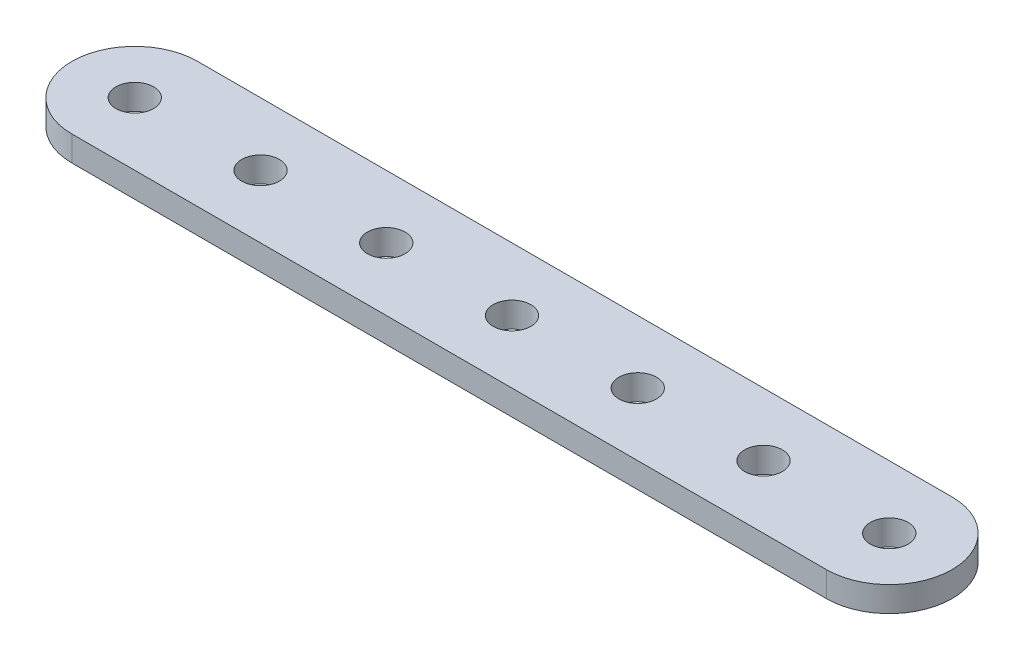
ISO-10303-21;
HEADER;
FILE_DESCRIPTION(('STEP AP214'),'2;1');
FILE_NAME('part.step','',(''),(''),'','','');
FILE_SCHEMA(('AUTOMOTIVE_DESIGN { 1 0 10303 214 1 1 1 1 }'));
ENDSEC;
DATA;
#1=APPLICATION_CONTEXT('core data for automotive mechanical design processes');
#2=APPLICATION_PROTOCOL_DEFINITION('international standard','automotive_design',2000,#1);
#3=PRODUCT_CONTEXT('',#1,'mechanical');
#4=PRODUCT('Part','Part','',(#3));
#5=PRODUCT_RELATED_PRODUCT_CATEGORY('part','',(#4));
#6=PRODUCT_DEFINITION_FORMATION('','',#4);
#7=PRODUCT_DEFINITION_CONTEXT('part definition',#1,'design');
#8=PRODUCT_DEFINITION('design','',#6,#7);
#9=PRODUCT_DEFINITION_SHAPE('','',#8);
#10=(LENGTH_UNIT() NAMED_UNIT(*) SI_UNIT(.MILLI.,.METRE.));
#11=(NAMED_UNIT(*) PLANE_ANGLE_UNIT() SI_UNIT($,.RADIAN.));
#12=(NAMED_UNIT(*) SI_UNIT($,.STERADIAN.) SOLID_ANGLE_UNIT());
#13=UNCERTAINTY_MEASURE_WITH_UNIT(LENGTH_MEASURE(1.E-05),#10,'distance_accuracy_value','');
#14=(GEOMETRIC_REPRESENTATION_CONTEXT(3) GLOBAL_UNCERTAINTY_ASSIGNED_CONTEXT((#13)) GLOBAL_UNIT_ASSIGNED_CONTEXT((#10,
#11,#12)) REPRESENTATION_CONTEXT('',''));
#15=CARTESIAN_POINT('',(0.,0.,0.));
#16=DIRECTION('',(0.,0.,1.));
#17=DIRECTION('',(1.,0.,0.));
#18=AXIS2_PLACEMENT_3D('',#15,#16,#17);
#19=CARTESIAN_POINT('',(-150.,10.,0.));
#20=DIRECTION('',(0.,1.,0.));
#21=DIRECTION('',(0.,0.,1.));
#22=AXIS2_PLACEMENT_3D('',#19,#20,#21);
#23=PLANE('',#22);
#24=CARTESIAN_POINT('',(50.,10.,0.));
#25=DIRECTION('',(0.,1.,0.));
#26=DIRECTION('',(0.,0.,1.));
#27=AXIS2_PLACEMENT_3D('',#24,#25,#26);
#28=CIRCLE('',#27,7.50000000000001);
#29=CARTESIAN_POINT('',(50.,10.,7.50000000000001));
#30=VERTEX_POINT('',#29);
#31=EDGE_CURVE('E171',#30,#30,#28,.T.);
#32=ORIENTED_EDGE('',*,*,#31,.F.);
#33=EDGE_LOOP('',(#32));
#34=FACE_BOUND('',#33,.T.);
#35=CARTESIAN_POINT('',(-50.,10.,0.));
#36=DIRECTION('',(0.,1.,0.));
#37=DIRECTION('',(0.,0.,1.));
#38=AXIS2_PLACEMENT_3D('',#35,#36,#37);
#39=CIRCLE('',#38,7.50000000000001);
#40=CARTESIAN_POINT('',(-50.,10.,7.50000000000001));
#41=VERTEX_POINT('',#40);
#42=EDGE_CURVE('E155',#41,#41,#39,.T.);
#43=ORIENTED_EDGE('',*,*,#42,.F.);
#44=EDGE_LOOP('',(#43));
#45=FACE_BOUND('',#44,.T.);
#46=CARTESIAN_POINT('',(150.,10.,0.));
#47=DIRECTION('',(0.,1.,0.));
#48=DIRECTION('',(0.,0.,1.));
#49=AXIS2_PLACEMENT_3D('',#46,#47,#48);
#50=CIRCLE('',#49,7.50000000000001);
#51=CARTESIAN_POINT('',(150.,10.,7.50000000000001));
#52=VERTEX_POINT('',#51);
#53=EDGE_CURVE('E139',#52,#52,#50,.T.);
#54=ORIENTED_EDGE('',*,*,#53,.F.);
#55=EDGE_LOOP('',(#54));
#56=FACE_BOUND('',#55,.T.);
#57=CARTESIAN_POINT('',(-150.,10.,0.));
#58=DIRECTION('',(0.,1.,0.));
#59=DIRECTION('',(0.,0.,1.));
#60=AXIS2_PLACEMENT_3D('',#57,#58,#59);
#61=CIRCLE('',#60,25.);
#62=CARTESIAN_POINT('',(-150.,10.,-25.));
#63=VERTEX_POINT('',#62);
#64=CARTESIAN_POINT('',(-150.,10.,25.));
#65=VERTEX_POINT('',#64);
#66=EDGE_CURVE('E97',#63,#65,#61,.T.);
#67=ORIENTED_EDGE('',*,*,#66,.T.);
#68=DIRECTION('',(1.,0.,0.));
#69=VECTOR('',#68,1.);
#70=CARTESIAN_POINT('',(-150.,10.,25.));
#71=LINE('',#70,#69);
#72=CARTESIAN_POINT('',(150.,10.,25.));
#73=VERTEX_POINT('',#72);
#74=EDGE_CURVE('E92',#65,#73,#71,.T.);
#75=ORIENTED_EDGE('',*,*,#74,.T.);
#76=CARTESIAN_POINT('',(150.,10.,0.));
#77=DIRECTION('',(0.,1.,0.));
#78=DIRECTION('',(0.,0.,1.));
#79=AXIS2_PLACEMENT_3D('',#76,#77,#78);
#80=CIRCLE('',#79,25.);
#81=CARTESIAN_POINT('',(150.,10.,-25.0000000000001));
#82=VERTEX_POINT('',#81);
#83=EDGE_CURVE('E95',#73,#82,#80,.T.);
#84=ORIENTED_EDGE('',*,*,#83,.T.);
#85=DIRECTION('',(-1.,0.,0.));
#86=VECTOR('',#85,1.);
#87=CARTESIAN_POINT('',(-150.,10.,-25.));
#88=LINE('',#87,#86);
#89=EDGE_CURVE('E62',#82,#63,#88,.T.);
#90=ORIENTED_EDGE('',*,*,#89,.T.);
#91=EDGE_LOOP('',(#67,#75,#84,#90));
#92=FACE_BOUND('',#91,.T.);
#93=CARTESIAN_POINT('',(-150.,10.,0.));
#94=DIRECTION('',(0.,1.,0.));
#95=DIRECTION('',(0.,0.,1.));
#96=AXIS2_PLACEMENT_3D('',#93,#94,#95);
#97=CIRCLE('',#96,7.50000000000001);
#98=CARTESIAN_POINT('',(-150.,10.,7.50000000000001));
#99=VERTEX_POINT('',#98);
#100=EDGE_CURVE('E117',#99,#99,#97,.T.);
#101=ORIENTED_EDGE('',*,*,#100,.F.);
#102=EDGE_LOOP('',(#101));
#103=FACE_BOUND('',#102,.T.);
#104=CARTESIAN_POINT('',(-100.,10.,0.));
#105=DIRECTION('',(0.,1.,0.));
#106=DIRECTION('',(0.,0.,1.));
#107=AXIS2_PLACEMENT_3D('',#104,#105,#106);
#108=CIRCLE('',#107,7.50000000000001);
#109=CARTESIAN_POINT('',(-100.,10.,7.50000000000001));
#110=VERTEX_POINT('',#109);
#111=EDGE_CURVE('E147',#110,#110,#108,.T.);
#112=ORIENTED_EDGE('',*,*,#111,.F.);
#113=EDGE_LOOP('',(#112));
#114=FACE_BOUND('',#113,.T.);
#115=CARTESIAN_POINT('',(0.,10.,0.));
#116=DIRECTION('',(0.,1.,0.));
#117=DIRECTION('',(0.,0.,1.));
#118=AXIS2_PLACEMENT_3D('',#115,#116,#117);
#119=CIRCLE('',#118,7.50000000000001);
#120=CARTESIAN_POINT('',(0.,10.,7.50000000000001));
#121=VERTEX_POINT('',#120);
#122=EDGE_CURVE('E163',#121,#121,#119,.T.);
#123=ORIENTED_EDGE('',*,*,#122,.F.);
#124=EDGE_LOOP('',(#123));
#125=FACE_BOUND('',#124,.T.);
#126=CARTESIAN_POINT('',(100.,10.,0.));
#127=DIRECTION('',(0.,1.,0.));
#128=DIRECTION('',(0.,0.,1.));
#129=AXIS2_PLACEMENT_3D('',#126,#127,#128);
#130=CIRCLE('',#129,7.50000000000001);
#131=CARTESIAN_POINT('',(100.,10.,7.50000000000001));
#132=VERTEX_POINT('',#131);
#133=EDGE_CURVE('E179',#132,#132,#130,.T.);
#134=ORIENTED_EDGE('',*,*,#133,.F.);
#135=EDGE_LOOP('',(#134));
#136=FACE_BOUND('',#135,.T.);
#137=ADVANCED_FACE('F44',(#34,#45,#56,#92,#103,#114,#125,#136),#23,.T.);
#138=CARTESIAN_POINT('',(-150.,0.,0.));
#139=DIRECTION('',(0.,1.,0.));
#140=DIRECTION('',(0.,0.,1.));
#141=AXIS2_PLACEMENT_3D('',#138,#139,#140);
#142=PLANE('',#141);
#143=CARTESIAN_POINT('',(-150.,0.,0.));
#144=DIRECTION('',(0.,1.,0.));
#145=DIRECTION('',(0.,0.,1.));
#146=AXIS2_PLACEMENT_3D('',#143,#144,#145);
#147=CIRCLE('',#146,25.);
#148=CARTESIAN_POINT('',(-150.,0.,-25.));
#149=VERTEX_POINT('',#148);
#150=CARTESIAN_POINT('',(-150.,0.,25.));
#151=VERTEX_POINT('',#150);
#152=EDGE_CURVE('E113',#149,#151,#147,.T.);
#153=ORIENTED_EDGE('',*,*,#152,.F.);
#154=DIRECTION('',(-1.,0.,0.));
#155=VECTOR('',#154,1.);
#156=CARTESIAN_POINT('',(-150.,0.,-25.));
#157=LINE('',#156,#155);
#158=CARTESIAN_POINT('',(150.,0.,-25.0000000000001));
#159=VERTEX_POINT('',#158);
#160=EDGE_CURVE('E85',#159,#149,#157,.T.);
#161=ORIENTED_EDGE('',*,*,#160,.F.);
#162=CARTESIAN_POINT('',(150.,0.,0.));
#163=DIRECTION('',(0.,1.,0.));
#164=DIRECTION('',(0.,0.,1.));
#165=AXIS2_PLACEMENT_3D('',#162,#163,#164);
#166=CIRCLE('',#165,25.);
#167=CARTESIAN_POINT('',(150.,0.,25.));
#168=VERTEX_POINT('',#167);
#169=EDGE_CURVE('E79',#168,#159,#166,.T.);
#170=ORIENTED_EDGE('',*,*,#169,.F.);
#171=DIRECTION('',(1.,0.,0.));
#172=VECTOR('',#171,1.);
#173=CARTESIAN_POINT('',(-150.,0.,25.));
#174=LINE('',#173,#172);
#175=EDGE_CURVE('E102',#151,#168,#174,.T.);
#176=ORIENTED_EDGE('',*,*,#175,.F.);
#177=EDGE_LOOP('',(#153,#161,#170,#176));
#178=FACE_BOUND('',#177,.T.);
#179=CARTESIAN_POINT('',(-150.,0.,0.));
#180=DIRECTION('',(0.,1.,0.));
#181=DIRECTION('',(0.,0.,1.));
#182=AXIS2_PLACEMENT_3D('',#179,#180,#181);
#183=CIRCLE('',#182,7.50000000000001);
#184=CARTESIAN_POINT('',(-150.,0.,7.50000000000001));
#185=VERTEX_POINT('',#184);
#186=EDGE_CURVE('E135',#185,#185,#183,.T.);
#187=ORIENTED_EDGE('',*,*,#186,.T.);
#188=EDGE_LOOP('',(#187));
#189=FACE_BOUND('',#188,.T.);
#190=CARTESIAN_POINT('',(150.,0.,0.));
#191=DIRECTION('',(0.,1.,0.));
#192=DIRECTION('',(0.,0.,1.));
#193=AXIS2_PLACEMENT_3D('',#190,#191,#192);
#194=CIRCLE('',#193,7.50000000000001);
#195=CARTESIAN_POINT('',(150.,0.,7.50000000000001));
#196=VERTEX_POINT('',#195);
#197=EDGE_CURVE('E143',#196,#196,#194,.T.);
#198=ORIENTED_EDGE('',*,*,#197,.T.);
#199=EDGE_LOOP('',(#198));
#200=FACE_BOUND('',#199,.T.);
#201=CARTESIAN_POINT('',(-100.,0.,0.));
#202=DIRECTION('',(0.,1.,0.));
#203=DIRECTION('',(0.,0.,1.));
#204=AXIS2_PLACEMENT_3D('',#201,#202,#203);
#205=CIRCLE('',#204,7.50000000000001);
#206=CARTESIAN_POINT('',(-100.,0.,7.50000000000001));
#207=VERTEX_POINT('',#206);
#208=EDGE_CURVE('E151',#207,#207,#205,.T.);
#209=ORIENTED_EDGE('',*,*,#208,.T.);
#210=EDGE_LOOP('',(#209));
#211=FACE_BOUND('',#210,.T.);
#212=CARTESIAN_POINT('',(-50.,0.,0.));
#213=DIRECTION('',(0.,1.,0.));
#214=DIRECTION('',(0.,0.,1.));
#215=AXIS2_PLACEMENT_3D('',#212,#213,#214);
#216=CIRCLE('',#215,7.50000000000001);
#217=CARTESIAN_POINT('',(-50.,0.,7.50000000000001));
#218=VERTEX_POINT('',#217);
#219=EDGE_CURVE('E159',#218,#218,#216,.T.);
#220=ORIENTED_EDGE('',*,*,#219,.T.);
#221=EDGE_LOOP('',(#220));
#222=FACE_BOUND('',#221,.T.);
#223=CARTESIAN_POINT('',(0.,0.,0.));
#224=DIRECTION('',(0.,1.,0.));
#225=DIRECTION('',(0.,0.,1.));
#226=AXIS2_PLACEMENT_3D('',#223,#224,#225);
#227=CIRCLE('',#226,7.50000000000001);
#228=CARTESIAN_POINT('',(0.,0.,7.50000000000001));
#229=VERTEX_POINT('',#228);
#230=EDGE_CURVE('E167',#229,#229,#227,.T.);
#231=ORIENTED_EDGE('',*,*,#230,.T.);
#232=EDGE_LOOP('',(#231));
#233=FACE_BOUND('',#232,.T.);
#234=CARTESIAN_POINT('',(50.,0.,0.));
#235=DIRECTION('',(0.,1.,0.));
#236=DIRECTION('',(0.,0.,1.));
#237=AXIS2_PLACEMENT_3D('',#234,#235,#236);
#238=CIRCLE('',#237,7.50000000000001);
#239=CARTESIAN_POINT('',(50.,0.,7.50000000000001));
#240=VERTEX_POINT('',#239);
#241=EDGE_CURVE('E175',#240,#240,#238,.T.);
#242=ORIENTED_EDGE('',*,*,#241,.T.);
#243=EDGE_LOOP('',(#242));
#244=FACE_BOUND('',#243,.T.);
#245=CARTESIAN_POINT('',(100.,0.,0.));
#246=DIRECTION('',(0.,1.,0.));
#247=DIRECTION('',(0.,0.,1.));
#248=AXIS2_PLACEMENT_3D('',#245,#246,#247);
#249=CIRCLE('',#248,7.50000000000001);
#250=CARTESIAN_POINT('',(100.,0.,7.50000000000001));
#251=VERTEX_POINT('',#250);
#252=EDGE_CURVE('E183',#251,#251,#249,.T.);
#253=ORIENTED_EDGE('',*,*,#252,.T.);
#254=EDGE_LOOP('',(#253));
#255=FACE_BOUND('',#254,.T.);
#256=ADVANCED_FACE('F130',(#178,#189,#200,#211,#222,#233,#244,#255),#142,.F.);
#257=CARTESIAN_POINT('',(-150.,10.,0.));
#258=DIRECTION('',(0.,-1.,0.));
#259=DIRECTION('',(0.,0.,-1.));
#260=AXIS2_PLACEMENT_3D('',#257,#258,#259);
#261=CYLINDRICAL_SURFACE('',#260,25.);
#262=ORIENTED_EDGE('',*,*,#152,.T.);
#263=DIRECTION('',(0.,-1.,0.));
#264=VECTOR('',#263,1.);
#265=CARTESIAN_POINT('',(-150.,10.,25.));
#266=LINE('',#265,#264);
#267=EDGE_CURVE('E11',#65,#151,#266,.T.);
#268=ORIENTED_EDGE('',*,*,#267,.F.);
#269=ORIENTED_EDGE('',*,*,#66,.F.);
#270=DIRECTION('',(0.,-1.,0.));
#271=VECTOR('',#270,1.);
#272=CARTESIAN_POINT('',(-150.,10.,-25.));
#273=LINE('',#272,#271);
#274=EDGE_CURVE('E109',#63,#149,#273,.T.);
#275=ORIENTED_EDGE('',*,*,#274,.T.);
#276=EDGE_LOOP('',(#262,#268,#269,#275));
#277=FACE_BOUND('',#276,.T.);
#278=ADVANCED_FACE('F46',(#277),#261,.T.);
#279=CARTESIAN_POINT('',(-150.,10.,25.));
#280=DIRECTION('',(0.,0.,-1.));
#281=DIRECTION('',(-1.,0.,0.));
#282=AXIS2_PLACEMENT_3D('',#279,#280,#281);
#283=PLANE('',#282);
#284=ORIENTED_EDGE('',*,*,#175,.T.);
#285=DIRECTION('',(0.,-1.,0.));
#286=VECTOR('',#285,1.);
#287=CARTESIAN_POINT('',(150.,10.,25.));
#288=LINE('',#287,#286);
#289=EDGE_CURVE('E54',#73,#168,#288,.T.);
#290=ORIENTED_EDGE('',*,*,#289,.F.);
#291=ORIENTED_EDGE('',*,*,#74,.F.);
#292=ORIENTED_EDGE('',*,*,#267,.T.);
#293=EDGE_LOOP('',(#284,#290,#291,#292));
#294=FACE_BOUND('',#293,.T.);
#295=ADVANCED_FACE('F101',(#294),#283,.F.);
#296=CARTESIAN_POINT('',(150.,10.,0.));
#297=DIRECTION('',(0.,-1.,0.));
#298=DIRECTION('',(0.,0.,-1.));
#299=AXIS2_PLACEMENT_3D('',#296,#297,#298);
#300=CYLINDRICAL_SURFACE('',#299,25.);
#301=ORIENTED_EDGE('',*,*,#169,.T.);
#302=DIRECTION('',(0.,-1.,0.));
#303=VECTOR('',#302,1.);
#304=CARTESIAN_POINT('',(150.,10.,-25.0000000000001));
#305=LINE('',#304,#303);
#306=EDGE_CURVE('E104',#82,#159,#305,.T.);
#307=ORIENTED_EDGE('',*,*,#306,.F.);
#308=ORIENTED_EDGE('',*,*,#83,.F.);
#309=ORIENTED_EDGE('',*,*,#289,.T.);
#310=EDGE_LOOP('',(#301,#307,#308,#309));
#311=FACE_BOUND('',#310,.T.);
#312=ADVANCED_FACE('F105',(#311),#300,.T.);
#313=CARTESIAN_POINT('',(-150.,10.,-25.));
#314=DIRECTION('',(0.,0.,1.));
#315=DIRECTION('',(1.,0.,0.));
#316=AXIS2_PLACEMENT_3D('',#313,#314,#315);
#317=PLANE('',#316);
#318=ORIENTED_EDGE('',*,*,#160,.T.);
#319=ORIENTED_EDGE('',*,*,#274,.F.);
#320=ORIENTED_EDGE('',*,*,#89,.F.);
#321=ORIENTED_EDGE('',*,*,#306,.T.);
#322=EDGE_LOOP('',(#318,#319,#320,#321));
#323=FACE_BOUND('',#322,.T.);
#324=ADVANCED_FACE('F127',(#323),#317,.F.);
#325=CARTESIAN_POINT('',(-150.,10.,0.));
#326=DIRECTION('',(0.,-1.,0.));
#327=DIRECTION('',(0.,0.,-1.));
#328=AXIS2_PLACEMENT_3D('',#325,#326,#327);
#329=CYLINDRICAL_SURFACE('',#328,7.50000000000001);
#330=ORIENTED_EDGE('',*,*,#100,.T.);
#331=EDGE_LOOP('',(#330));
#332=FACE_BOUND('',#331,.T.);
#333=ORIENTED_EDGE('',*,*,#186,.F.);
#334=EDGE_LOOP('',(#333));
#335=FACE_BOUND('',#334,.T.);
#336=ADVANCED_FACE('F204',(#332,#335),#329,.F.);
#337=CARTESIAN_POINT('',(150.,10.,0.));
#338=DIRECTION('',(0.,-1.,0.));
#339=DIRECTION('',(0.,0.,-1.));
#340=AXIS2_PLACEMENT_3D('',#337,#338,#339);
#341=CYLINDRICAL_SURFACE('',#340,7.50000000000001);
#342=ORIENTED_EDGE('',*,*,#53,.T.);
#343=EDGE_LOOP('',(#342));
#344=FACE_BOUND('',#343,.T.);
#345=ORIENTED_EDGE('',*,*,#197,.F.);
#346=EDGE_LOOP('',(#345));
#347=FACE_BOUND('',#346,.T.);
#348=ADVANCED_FACE('F258',(#344,#347),#341,.F.);
#349=CARTESIAN_POINT('',(-100.,10.,0.));
#350=DIRECTION('',(0.,-1.,0.));
#351=DIRECTION('',(0.,0.,-1.));
#352=AXIS2_PLACEMENT_3D('',#349,#350,#351);
#353=CYLINDRICAL_SURFACE('',#352,7.50000000000001);
#354=ORIENTED_EDGE('',*,*,#111,.T.);
#355=EDGE_LOOP('',(#354));
#356=FACE_BOUND('',#355,.T.);
#357=ORIENTED_EDGE('',*,*,#208,.F.);
#358=EDGE_LOOP('',(#357));
#359=FACE_BOUND('',#358,.T.);
#360=ADVANCED_FACE('F267',(#356,#359),#353,.F.);
#361=CARTESIAN_POINT('',(-50.,10.,0.));
#362=DIRECTION('',(0.,-1.,0.));
#363=DIRECTION('',(0.,0.,-1.));
#364=AXIS2_PLACEMENT_3D('',#361,#362,#363);
#365=CYLINDRICAL_SURFACE('',#364,7.50000000000001);
#366=ORIENTED_EDGE('',*,*,#42,.T.);
#367=EDGE_LOOP('',(#366));
#368=FACE_BOUND('',#367,.T.);
#369=ORIENTED_EDGE('',*,*,#219,.F.);
#370=EDGE_LOOP('',(#369));
#371=FACE_BOUND('',#370,.T.);
#372=ADVANCED_FACE('F276',(#368,#371),#365,.F.);
#373=CARTESIAN_POINT('',(0.,10.,0.));
#374=DIRECTION('',(0.,-1.,0.));
#375=DIRECTION('',(0.,0.,-1.));
#376=AXIS2_PLACEMENT_3D('',#373,#374,#375);
#377=CYLINDRICAL_SURFACE('',#376,7.50000000000001);
#378=ORIENTED_EDGE('',*,*,#122,.T.);
#379=EDGE_LOOP('',(#378));
#380=FACE_BOUND('',#379,.T.);
#381=ORIENTED_EDGE('',*,*,#230,.F.);
#382=EDGE_LOOP('',(#381));
#383=FACE_BOUND('',#382,.T.);
#384=ADVANCED_FACE('F286',(#380,#383),#377,.F.);
#385=CARTESIAN_POINT('',(50.,10.,0.));
#386=DIRECTION('',(0.,-1.,0.));
#387=DIRECTION('',(0.,0.,-1.));
#388=AXIS2_PLACEMENT_3D('',#385,#386,#387);
#389=CYLINDRICAL_SURFACE('',#388,7.50000000000001);
#390=ORIENTED_EDGE('',*,*,#31,.T.);
#391=EDGE_LOOP('',(#390));
#392=FACE_BOUND('',#391,.T.);
#393=ORIENTED_EDGE('',*,*,#241,.F.);
#394=EDGE_LOOP('',(#393));
#395=FACE_BOUND('',#394,.T.);
#396=ADVANCED_FACE('F296',(#392,#395),#389,.F.);
#397=CARTESIAN_POINT('',(100.,10.,0.));
#398=DIRECTION('',(0.,-1.,0.));
#399=DIRECTION('',(0.,0.,-1.));
#400=AXIS2_PLACEMENT_3D('',#397,#398,#399);
#401=CYLINDRICAL_SURFACE('',#400,7.50000000000001);
#402=ORIENTED_EDGE('',*,*,#133,.T.);
#403=EDGE_LOOP('',(#402));
#404=FACE_BOUND('',#403,.T.);
#405=ORIENTED_EDGE('',*,*,#252,.F.);
#406=EDGE_LOOP('',(#405));
#407=FACE_BOUND('',#406,.T.);
#408=ADVANCED_FACE('F191',(#404,#407),#401,.F.);
#409=CLOSED_SHELL('',(#137,#256,#278,#295,#312,#324,#336,#348,#360,#372,#384,#396,#408));
#410=MANIFOLD_SOLID_BREP('B2',#409);
#411=ADVANCED_BREP_SHAPE_REPRESENTATION('',(#18,#410),#14);
#412=SHAPE_DEFINITION_REPRESENTATION(#9,#411);
ENDSEC;
END-ISO-10303-21;
